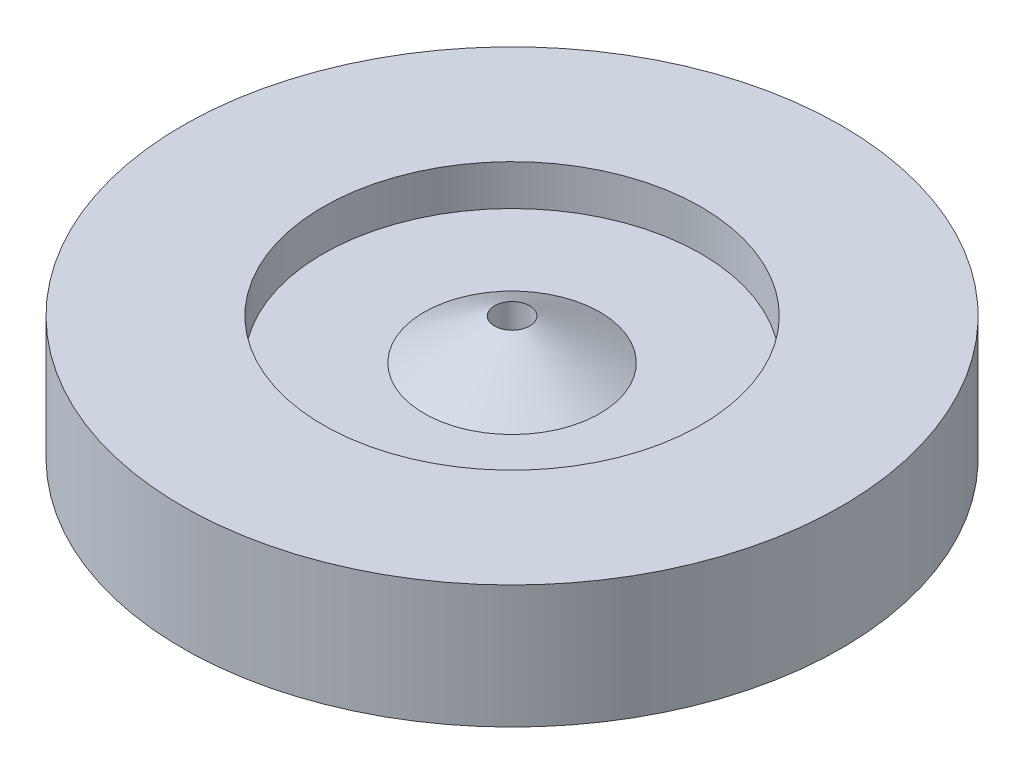
ISO-10303-21;
HEADER;
FILE_DESCRIPTION(('STEP AP214'),'2;1');
FILE_NAME('part.step','',(''),(''),'','','');
FILE_SCHEMA(('AUTOMOTIVE_DESIGN { 1 0 10303 214 1 1 1 1 }'));
ENDSEC;
DATA;
#1=APPLICATION_CONTEXT('core data for automotive mechanical design processes');
#2=APPLICATION_PROTOCOL_DEFINITION('international standard','automotive_design',2000,#1);
#3=PRODUCT_CONTEXT('',#1,'mechanical');
#4=PRODUCT('Part','Part','',(#3));
#5=PRODUCT_RELATED_PRODUCT_CATEGORY('part','',(#4));
#6=PRODUCT_DEFINITION_FORMATION('','',#4);
#7=PRODUCT_DEFINITION_CONTEXT('part definition',#1,'design');
#8=PRODUCT_DEFINITION('design','',#6,#7);
#9=PRODUCT_DEFINITION_SHAPE('','',#8);
#10=(LENGTH_UNIT() NAMED_UNIT(*) SI_UNIT(.MILLI.,.METRE.));
#11=(NAMED_UNIT(*) PLANE_ANGLE_UNIT() SI_UNIT($,.RADIAN.));
#12=(NAMED_UNIT(*) SI_UNIT($,.STERADIAN.) SOLID_ANGLE_UNIT());
#13=UNCERTAINTY_MEASURE_WITH_UNIT(LENGTH_MEASURE(1.E-05),#10,'distance_accuracy_value','');
#14=(GEOMETRIC_REPRESENTATION_CONTEXT(3) GLOBAL_UNCERTAINTY_ASSIGNED_CONTEXT((#13)) GLOBAL_UNIT_ASSIGNED_CONTEXT((#10,
#11,#12)) REPRESENTATION_CONTEXT('',''));
#15=CARTESIAN_POINT('',(0.,0.,0.));
#16=DIRECTION('',(0.,0.,1.));
#17=DIRECTION('',(1.,0.,0.));
#18=AXIS2_PLACEMENT_3D('',#15,#16,#17);
#19=CARTESIAN_POINT('',(0.,11.9059892324149,0.));
#20=DIRECTION('',(0.,-1.,0.));
#21=DIRECTION('',(0.,0.,-1.));
#22=AXIS2_PLACEMENT_3D('',#19,#20,#21);
#23=CONICAL_SURFACE('',#22,50.,1.0471975511966);
#24=CARTESIAN_POINT('',(0.,35.,0.));
#25=DIRECTION('',(0.,-1.,0.));
#26=DIRECTION('',(0.,0.,-1.));
#27=AXIS2_PLACEMENT_3D('',#24,#25,#26);
#28=CIRCLE('',#27,10.);
#29=CARTESIAN_POINT('',(0.,35.,-10.));
#30=VERTEX_POINT('',#29);
#31=EDGE_CURVE('E10',#30,#30,#28,.T.);
#32=CARTESIAN_POINT('',(0.,11.9059892324149,0.));
#33=DIRECTION('',(0.,-1.,0.));
#34=DIRECTION('',(0.,0.,-1.));
#35=AXIS2_PLACEMENT_3D('',#32,#33,#34);
#36=CIRCLE('',#35,50.);
#37=CARTESIAN_POINT('',(0.,11.9059892324149,-50.));
#38=VERTEX_POINT('',#37);
#39=EDGE_CURVE('E65',#38,#38,#36,.T.);
#40=CARTESIAN_POINT('',(0.,35.,-10.));
#41=CARTESIAN_POINT('',(0.,34.7594373878377,-10.4166666666667));
#42=CARTESIAN_POINT('',(0.,34.5188747756753,-10.8333333333333));
#43=CARTESIAN_POINT('',(0.,34.0377495513506,-11.6666666666667));
#44=CARTESIAN_POINT('',(0.,33.7971869391883,-12.0833333333333));
#45=CARTESIAN_POINT('',(0.,33.3160617148636,-12.9166666666667));
#46=CARTESIAN_POINT('',(0.,33.0754991027012,-13.3333333333333));
#47=CARTESIAN_POINT('',(0.,32.5943738783766,-14.1666666666667));
#48=CARTESIAN_POINT('',(0.,32.3538112662142,-14.5833333333333));
#49=CARTESIAN_POINT('',(0.,31.8726860418895,-15.4166666666667));
#50=CARTESIAN_POINT('',(0.,31.6321234297272,-15.8333333333333));
#51=CARTESIAN_POINT('',(0.,31.1509982054025,-16.6666666666667));
#52=CARTESIAN_POINT('',(0.,30.9104355932401,-17.0833333333333));
#53=CARTESIAN_POINT('',(0.,30.4293103689154,-17.9166666666667));
#54=CARTESIAN_POINT('',(0.,30.1887477567531,-18.3333333333333));
#55=CARTESIAN_POINT('',(0.,29.7076225324284,-19.1666666666667));
#56=CARTESIAN_POINT('',(0.,29.4670599202661,-19.5833333333333));
#57=CARTESIAN_POINT('',(0.,28.9859346959414,-20.4166666666667));
#58=CARTESIAN_POINT('',(0.,28.745372083779,-20.8333333333333));
#59=CARTESIAN_POINT('',(0.,28.2642468594543,-21.6666666666667));
#60=CARTESIAN_POINT('',(0.,28.023684247292,-22.0833333333333));
#61=CARTESIAN_POINT('',(0.,27.5425590229673,-22.9166666666667));
#62=CARTESIAN_POINT('',(0.,27.301996410805,-23.3333333333333));
#63=CARTESIAN_POINT('',(0.,26.8208711864803,-24.1666666666667));
#64=CARTESIAN_POINT('',(0.,26.5803085743179,-24.5833333333333));
#65=CARTESIAN_POINT('',(0.,26.0991833499932,-25.4166666666667));
#66=CARTESIAN_POINT('',(0.,25.8586207378309,-25.8333333333333));
#67=CARTESIAN_POINT('',(0.,25.3774955135062,-26.6666666666667));
#68=CARTESIAN_POINT('',(0.,25.1369329013439,-27.0833333333333));
#69=CARTESIAN_POINT('',(0.,24.6558076770192,-27.9166666666667));
#70=CARTESIAN_POINT('',(0.,24.4152450648568,-28.3333333333333));
#71=CARTESIAN_POINT('',(0.,23.9341198405321,-29.1666666666667));
#72=CARTESIAN_POINT('',(0.,23.6935572283698,-29.5833333333333));
#73=CARTESIAN_POINT('',(0.,23.2124320040451,-30.4166666666667));
#74=CARTESIAN_POINT('',(0.,22.9718693918828,-30.8333333333333));
#75=CARTESIAN_POINT('',(0.,22.4907441675581,-31.6666666666667));
#76=CARTESIAN_POINT('',(0.,22.2501815553957,-32.0833333333333));
#77=CARTESIAN_POINT('',(0.,21.769056331071,-32.9166666666667));
#78=CARTESIAN_POINT('',(0.,21.5284937189087,-33.3333333333333));
#79=CARTESIAN_POINT('',(0.,21.047368494584,-34.1666666666667));
#80=CARTESIAN_POINT('',(0.,20.8068058824217,-34.5833333333333));
#81=CARTESIAN_POINT('',(0.,20.325680658097,-35.4166666666667));
#82=CARTESIAN_POINT('',(0.,20.0851180459346,-35.8333333333333));
#83=CARTESIAN_POINT('',(0.,19.6039928216099,-36.6666666666667));
#84=CARTESIAN_POINT('',(0.,19.3634302094476,-37.0833333333333));
#85=CARTESIAN_POINT('',(0.,18.8823049851229,-37.9166666666667));
#86=CARTESIAN_POINT('',(0.,18.6417423729606,-38.3333333333333));
#87=CARTESIAN_POINT('',(0.,18.1606171486359,-39.1666666666667));
#88=CARTESIAN_POINT('',(0.,17.9200545364735,-39.5833333333333));
#89=CARTESIAN_POINT('',(0.,17.4389293121488,-40.4166666666667));
#90=CARTESIAN_POINT('',(0.,17.1983666999865,-40.8333333333333));
#91=CARTESIAN_POINT('',(0.,16.7172414756618,-41.6666666666667));
#92=CARTESIAN_POINT('',(0.,16.4766788634995,-42.0833333333333));
#93=CARTESIAN_POINT('',(0.,15.9955536391748,-42.9166666666667));
#94=CARTESIAN_POINT('',(0.,15.7549910270124,-43.3333333333333));
#95=CARTESIAN_POINT('',(0.,15.2738658026877,-44.1666666666667));
#96=CARTESIAN_POINT('',(0.,15.0333031905254,-44.5833333333333));
#97=CARTESIAN_POINT('',(0.,14.5521779662007,-45.4166666666667));
#98=CARTESIAN_POINT('',(0.,14.3116153540384,-45.8333333333333));
#99=CARTESIAN_POINT('',(0.,13.8304901297137,-46.6666666666667));
#100=CARTESIAN_POINT('',(0.,13.5899275175513,-47.0833333333333));
#101=CARTESIAN_POINT('',(0.,13.1088022932266,-47.9166666666667));
#102=CARTESIAN_POINT('',(0.,12.8682396810643,-48.3333333333333));
#103=CARTESIAN_POINT('',(0.,12.3871144567396,-49.1666666666667));
#104=CARTESIAN_POINT('',(0.,12.1465518445773,-49.5833333333333));
#105=CARTESIAN_POINT('',(0.,11.9059892324149,-50.));
#106=B_SPLINE_CURVE_WITH_KNOTS('',3,(#40,#41,#42,#43,#44,#45,#46,#47,#48,#49,#50,#51,#52,#53,
#54,#55,#56,#57,#58,#59,#60,#61,#62,#63,#64,#65,#66,#67,#68,#69,#70,#71,#72,#73,#74,#75,#76,#77,
#78,#79,#80,#81,#82,#83,#84,#85,#86,#87,#88,#89,#90,#91,#92,#93,#94,#95,#96,#97,#98,#99,#100,
#101,#102,#103,#104,#105),.UNSPECIFIED.,.F.,.F.,(4,2,2,2,2,2,2,2,2,2,2,2,2,2,2,2,2,2,2,2,2,2,2,
2,2,2,2,2,2,2,2,2,4),(0.,1.44337567297407,2.88675134594813,4.3301270189222,5.77350269189626,
7.21687836487033,8.6602540378444,10.1036297108185,11.5470053837925,12.9903810567666,
14.4337567297407,15.8771324027147,17.3205080756888,18.7638837486628,20.2072594216369,
21.650635094611,23.094010767585,24.5373864405591,25.9807621135332,27.4241377865072,
28.8675134594813,30.3108891324554,31.7542648054294,33.1976404784035,34.6410161513776,
36.0843918243516,37.5277674973257,38.9711431702998,40.4145188432738,41.8578945162479,
43.301270189222,44.744645862196,46.1880215351701),.UNSPECIFIED.);
#107=EDGE_CURVE('BSEAM31',#30,#38,#106,.T.);
#108=ORIENTED_EDGE('',*,*,#31,.T.);
#109=ORIENTED_EDGE('',*,*,#39,.F.);
#110=ORIENTED_EDGE('',*,*,#107,.T.);
#111=ORIENTED_EDGE('',*,*,#107,.F.);
#112=EDGE_LOOP('',(#108,#110,#109,#111));
#113=FACE_BOUND('',#112,.T.);
#114=ADVANCED_FACE('F31',(#113),#23,.T.);
#115=CARTESIAN_POINT('',(0.,0.,0.));
#116=DIRECTION('',(0.,-1.,0.));
#117=DIRECTION('',(0.,0.,-1.));
#118=AXIS2_PLACEMENT_3D('',#115,#116,#117);
#119=CYLINDRICAL_SURFACE('',#118,10.);
#120=CARTESIAN_POINT('',(0.,-35.,0.));
#121=DIRECTION('',(0.,-1.,0.));
#122=DIRECTION('',(0.,0.,-1.));
#123=AXIS2_PLACEMENT_3D('',#120,#121,#122);
#124=CIRCLE('',#123,10.);
#125=CARTESIAN_POINT('',(0.,-35.,10.));
#126=VERTEX_POINT('',#125);
#127=EDGE_CURVE('E37',#126,#126,#124,.T.);
#128=ORIENTED_EDGE('',*,*,#127,.T.);
#129=EDGE_LOOP('',(#128));
#130=FACE_BOUND('',#129,.T.);
#131=ORIENTED_EDGE('',*,*,#31,.F.);
#132=EDGE_LOOP('',(#131));
#133=FACE_BOUND('',#132,.T.);
#134=ADVANCED_FACE('F73',(#130,#133),#119,.F.);
#135=CARTESIAN_POINT('',(0.,-35.,0.));
#136=DIRECTION('',(0.,1.,0.));
#137=DIRECTION('',(0.,0.,1.));
#138=AXIS2_PLACEMENT_3D('',#135,#136,#137);
#139=CONICAL_SURFACE('',#138,10.,1.0471975511966);
#140=CARTESIAN_POINT('',(0.,-11.9059892324149,0.));
#141=DIRECTION('',(0.,-1.,0.));
#142=DIRECTION('',(0.,0.,-1.));
#143=AXIS2_PLACEMENT_3D('',#140,#141,#142);
#144=CIRCLE('',#143,50.);
#145=CARTESIAN_POINT('',(0.,-11.9059892324149,50.));
#146=VERTEX_POINT('',#145);
#147=EDGE_CURVE('E41',#146,#146,#144,.T.);
#148=CARTESIAN_POINT('',(0.,-11.9059892324149,50.));
#149=CARTESIAN_POINT('',(0.,-12.1465518445773,49.5833333333333));
#150=CARTESIAN_POINT('',(0.,-12.3871144567396,49.1666666666667));
#151=CARTESIAN_POINT('',(0.,-12.8682396810643,48.3333333333333));
#152=CARTESIAN_POINT('',(0.,-13.1088022932266,47.9166666666667));
#153=CARTESIAN_POINT('',(0.,-13.5899275175513,47.0833333333333));
#154=CARTESIAN_POINT('',(0.,-13.8304901297137,46.6666666666667));
#155=CARTESIAN_POINT('',(0.,-14.3116153540384,45.8333333333333));
#156=CARTESIAN_POINT('',(0.,-14.5521779662007,45.4166666666667));
#157=CARTESIAN_POINT('',(0.,-15.0333031905254,44.5833333333333));
#158=CARTESIAN_POINT('',(0.,-15.2738658026877,44.1666666666667));
#159=CARTESIAN_POINT('',(0.,-15.7549910270124,43.3333333333333));
#160=CARTESIAN_POINT('',(0.,-15.9955536391748,42.9166666666667));
#161=CARTESIAN_POINT('',(0.,-16.4766788634995,42.0833333333333));
#162=CARTESIAN_POINT('',(0.,-16.7172414756618,41.6666666666667));
#163=CARTESIAN_POINT('',(0.,-17.1983666999865,40.8333333333333));
#164=CARTESIAN_POINT('',(0.,-17.4389293121488,40.4166666666667));
#165=CARTESIAN_POINT('',(0.,-17.9200545364735,39.5833333333333));
#166=CARTESIAN_POINT('',(0.,-18.1606171486359,39.1666666666667));
#167=CARTESIAN_POINT('',(0.,-18.6417423729606,38.3333333333333));
#168=CARTESIAN_POINT('',(0.,-18.8823049851229,37.9166666666667));
#169=CARTESIAN_POINT('',(0.,-19.3634302094476,37.0833333333333));
#170=CARTESIAN_POINT('',(0.,-19.6039928216099,36.6666666666667));
#171=CARTESIAN_POINT('',(0.,-20.0851180459346,35.8333333333333));
#172=CARTESIAN_POINT('',(0.,-20.325680658097,35.4166666666667));
#173=CARTESIAN_POINT('',(0.,-20.8068058824217,34.5833333333333));
#174=CARTESIAN_POINT('',(0.,-21.047368494584,34.1666666666667));
#175=CARTESIAN_POINT('',(0.,-21.5284937189087,33.3333333333333));
#176=CARTESIAN_POINT('',(0.,-21.769056331071,32.9166666666667));
#177=CARTESIAN_POINT('',(0.,-22.2501815553957,32.0833333333333));
#178=CARTESIAN_POINT('',(0.,-22.4907441675581,31.6666666666667));
#179=CARTESIAN_POINT('',(0.,-22.9718693918828,30.8333333333333));
#180=CARTESIAN_POINT('',(0.,-23.2124320040451,30.4166666666667));
#181=CARTESIAN_POINT('',(0.,-23.6935572283698,29.5833333333333));
#182=CARTESIAN_POINT('',(0.,-23.9341198405321,29.1666666666667));
#183=CARTESIAN_POINT('',(0.,-24.4152450648568,28.3333333333333));
#184=CARTESIAN_POINT('',(0.,-24.6558076770192,27.9166666666667));
#185=CARTESIAN_POINT('',(0.,-25.1369329013439,27.0833333333333));
#186=CARTESIAN_POINT('',(0.,-25.3774955135062,26.6666666666667));
#187=CARTESIAN_POINT('',(0.,-25.8586207378309,25.8333333333333));
#188=CARTESIAN_POINT('',(0.,-26.0991833499932,25.4166666666667));
#189=CARTESIAN_POINT('',(0.,-26.5803085743179,24.5833333333333));
#190=CARTESIAN_POINT('',(0.,-26.8208711864803,24.1666666666667));
#191=CARTESIAN_POINT('',(0.,-27.301996410805,23.3333333333333));
#192=CARTESIAN_POINT('',(0.,-27.5425590229673,22.9166666666667));
#193=CARTESIAN_POINT('',(0.,-28.023684247292,22.0833333333333));
#194=CARTESIAN_POINT('',(0.,-28.2642468594543,21.6666666666667));
#195=CARTESIAN_POINT('',(0.,-28.745372083779,20.8333333333333));
#196=CARTESIAN_POINT('',(0.,-28.9859346959414,20.4166666666667));
#197=CARTESIAN_POINT('',(0.,-29.4670599202661,19.5833333333333));
#198=CARTESIAN_POINT('',(0.,-29.7076225324284,19.1666666666667));
#199=CARTESIAN_POINT('',(0.,-30.1887477567531,18.3333333333333));
#200=CARTESIAN_POINT('',(0.,-30.4293103689154,17.9166666666667));
#201=CARTESIAN_POINT('',(0.,-30.9104355932401,17.0833333333333));
#202=CARTESIAN_POINT('',(0.,-31.1509982054025,16.6666666666667));
#203=CARTESIAN_POINT('',(0.,-31.6321234297272,15.8333333333333));
#204=CARTESIAN_POINT('',(0.,-31.8726860418895,15.4166666666667));
#205=CARTESIAN_POINT('',(0.,-32.3538112662142,14.5833333333333));
#206=CARTESIAN_POINT('',(0.,-32.5943738783766,14.1666666666667));
#207=CARTESIAN_POINT('',(0.,-33.0754991027012,13.3333333333333));
#208=CARTESIAN_POINT('',(0.,-33.3160617148636,12.9166666666667));
#209=CARTESIAN_POINT('',(0.,-33.7971869391883,12.0833333333333));
#210=CARTESIAN_POINT('',(0.,-34.0377495513506,11.6666666666667));
#211=CARTESIAN_POINT('',(0.,-34.5188747756753,10.8333333333333));
#212=CARTESIAN_POINT('',(0.,-34.7594373878377,10.4166666666667));
#213=CARTESIAN_POINT('',(0.,-35.,10.));
#214=B_SPLINE_CURVE_WITH_KNOTS('',3,(#148,#149,#150,#151,#152,#153,#154,#155,#156,#157,#158,
#159,#160,#161,#162,#163,#164,#165,#166,#167,#168,#169,#170,#171,#172,#173,#174,#175,#176,#177,
#178,#179,#180,#181,#182,#183,#184,#185,#186,#187,#188,#189,#190,#191,#192,#193,#194,#195,#196,
#197,#198,#199,#200,#201,#202,#203,#204,#205,#206,#207,#208,#209,#210,#211,#212,#213),
.UNSPECIFIED.,.F.,.F.,(4,2,2,2,2,2,2,2,2,2,2,2,2,2,2,2,2,2,2,2,2,2,2,2,2,2,2,2,2,2,2,2,4),(0.,
1.44337567297407,2.88675134594813,4.3301270189222,5.77350269189626,7.21687836487033,
8.6602540378444,10.1036297108185,11.5470053837925,12.9903810567666,14.4337567297406,
15.8771324027147,17.3205080756888,18.7638837486628,20.2072594216369,21.650635094611,
23.094010767585,24.5373864405591,25.9807621135332,27.4241377865072,28.8675134594813,
30.3108891324554,31.7542648054294,33.1976404784035,34.6410161513776,36.0843918243516,
37.5277674973257,38.9711431702998,40.4145188432738,41.8578945162479,43.301270189222,
44.744645862196,46.1880215351701),.UNSPECIFIED.);
#215=EDGE_CURVE('BSEAM77',#146,#126,#214,.T.);
#216=ORIENTED_EDGE('',*,*,#147,.T.);
#217=ORIENTED_EDGE('',*,*,#127,.F.);
#218=ORIENTED_EDGE('',*,*,#215,.T.);
#219=ORIENTED_EDGE('',*,*,#215,.F.);
#220=EDGE_LOOP('',(#216,#218,#217,#219));
#221=FACE_BOUND('',#220,.T.);
#222=ADVANCED_FACE('F77',(#221),#139,.T.);
#223=CARTESIAN_POINT('',(0.,-11.9059892324149,-50.));
#224=DIRECTION('',(0.,-1.,0.));
#225=DIRECTION('',(0.,0.,-1.));
#226=AXIS2_PLACEMENT_3D('',#223,#224,#225);
#227=PLANE('',#226);
#228=CARTESIAN_POINT('',(0.,-11.9059892324149,0.));
#229=DIRECTION('',(0.,-1.,0.));
#230=DIRECTION('',(0.,0.,-1.));
#231=AXIS2_PLACEMENT_3D('',#228,#229,#230);
#232=CIRCLE('',#231,107.5);
#233=CARTESIAN_POINT('',(0.,-11.9059892324149,-107.5));
#234=VERTEX_POINT('',#233);
#235=EDGE_CURVE('E45',#234,#234,#232,.T.);
#236=ORIENTED_EDGE('',*,*,#235,.T.);
#237=EDGE_LOOP('',(#236));
#238=FACE_BOUND('',#237,.T.);
#239=ORIENTED_EDGE('',*,*,#147,.F.);
#240=EDGE_LOOP('',(#239));
#241=FACE_BOUND('',#240,.T.);
#242=ADVANCED_FACE('F81',(#238,#241),#227,.T.);
#243=CARTESIAN_POINT('',(0.,0.,0.));
#244=DIRECTION('',(0.,-1.,0.));
#245=DIRECTION('',(0.,0.,-1.));
#246=AXIS2_PLACEMENT_3D('',#243,#244,#245);
#247=CYLINDRICAL_SURFACE('',#246,107.5);
#248=CARTESIAN_POINT('',(0.,-35.,0.));
#249=DIRECTION('',(0.,-1.,0.));
#250=DIRECTION('',(0.,0.,-1.));
#251=AXIS2_PLACEMENT_3D('',#248,#249,#250);
#252=CIRCLE('',#251,107.5);
#253=CARTESIAN_POINT('',(0.,-35.,-107.5));
#254=VERTEX_POINT('',#253);
#255=EDGE_CURVE('E50',#254,#254,#252,.T.);
#256=ORIENTED_EDGE('',*,*,#255,.T.);
#257=EDGE_LOOP('',(#256));
#258=FACE_BOUND('',#257,.T.);
#259=ORIENTED_EDGE('',*,*,#235,.F.);
#260=EDGE_LOOP('',(#259));
#261=FACE_BOUND('',#260,.T.);
#262=ADVANCED_FACE('F88',(#258,#261),#247,.F.);
#263=CARTESIAN_POINT('',(0.,-35.,-107.5));
#264=DIRECTION('',(0.,-1.,0.));
#265=DIRECTION('',(0.,0.,-1.));
#266=AXIS2_PLACEMENT_3D('',#263,#264,#265);
#267=PLANE('',#266);
#268=CARTESIAN_POINT('',(0.,-35.,0.));
#269=DIRECTION('',(0.,-1.,0.));
#270=DIRECTION('',(0.,0.,-1.));
#271=AXIS2_PLACEMENT_3D('',#268,#269,#270);
#272=CIRCLE('',#271,187.5);
#273=CARTESIAN_POINT('',(0.,-35.,-187.5));
#274=VERTEX_POINT('',#273);
#275=EDGE_CURVE('E53',#274,#274,#272,.T.);
#276=ORIENTED_EDGE('',*,*,#275,.T.);
#277=EDGE_LOOP('',(#276));
#278=FACE_BOUND('',#277,.T.);
#279=ORIENTED_EDGE('',*,*,#255,.F.);
#280=EDGE_LOOP('',(#279));
#281=FACE_BOUND('',#280,.T.);
#282=ADVANCED_FACE('F92',(#278,#281),#267,.T.);
#283=CARTESIAN_POINT('',(0.,0.,0.));
#284=DIRECTION('',(0.,-1.,0.));
#285=DIRECTION('',(0.,0.,-1.));
#286=AXIS2_PLACEMENT_3D('',#283,#284,#285);
#287=CYLINDRICAL_SURFACE('',#286,187.5);
#288=CARTESIAN_POINT('',(0.,35.,0.));
#289=DIRECTION('',(0.,-1.,0.));
#290=DIRECTION('',(0.,0.,-1.));
#291=AXIS2_PLACEMENT_3D('',#288,#289,#290);
#292=CIRCLE('',#291,187.5);
#293=CARTESIAN_POINT('',(0.,35.,-187.5));
#294=VERTEX_POINT('',#293);
#295=EDGE_CURVE('E56',#294,#294,#292,.T.);
#296=ORIENTED_EDGE('',*,*,#295,.T.);
#297=EDGE_LOOP('',(#296));
#298=FACE_BOUND('',#297,.T.);
#299=ORIENTED_EDGE('',*,*,#275,.F.);
#300=EDGE_LOOP('',(#299));
#301=FACE_BOUND('',#300,.T.);
#302=ADVANCED_FACE('F96',(#298,#301),#287,.T.);
#303=CARTESIAN_POINT('',(0.,35.,-107.5));
#304=DIRECTION('',(0.,1.,0.));
#305=DIRECTION('',(0.,0.,1.));
#306=AXIS2_PLACEMENT_3D('',#303,#304,#305);
#307=PLANE('',#306);
#308=CARTESIAN_POINT('',(0.,35.,0.));
#309=DIRECTION('',(0.,-1.,0.));
#310=DIRECTION('',(0.,0.,-1.));
#311=AXIS2_PLACEMENT_3D('',#308,#309,#310);
#312=CIRCLE('',#311,107.5);
#313=CARTESIAN_POINT('',(0.,35.,-107.5));
#314=VERTEX_POINT('',#313);
#315=EDGE_CURVE('E59',#314,#314,#312,.T.);
#316=ORIENTED_EDGE('',*,*,#315,.T.);
#317=EDGE_LOOP('',(#316));
#318=FACE_BOUND('',#317,.T.);
#319=ORIENTED_EDGE('',*,*,#295,.F.);
#320=EDGE_LOOP('',(#319));
#321=FACE_BOUND('',#320,.T.);
#322=ADVANCED_FACE('F100',(#318,#321),#307,.T.);
#323=CARTESIAN_POINT('',(0.,0.,0.));
#324=DIRECTION('',(0.,-1.,0.));
#325=DIRECTION('',(0.,0.,-1.));
#326=AXIS2_PLACEMENT_3D('',#323,#324,#325);
#327=CYLINDRICAL_SURFACE('',#326,107.5);
#328=CARTESIAN_POINT('',(0.,11.9059892324149,0.));
#329=DIRECTION('',(0.,-1.,0.));
#330=DIRECTION('',(0.,0.,-1.));
#331=AXIS2_PLACEMENT_3D('',#328,#329,#330);
#332=CIRCLE('',#331,107.5);
#333=CARTESIAN_POINT('',(0.,11.9059892324149,-107.5));
#334=VERTEX_POINT('',#333);
#335=EDGE_CURVE('E62',#334,#334,#332,.T.);
#336=ORIENTED_EDGE('',*,*,#335,.T.);
#337=EDGE_LOOP('',(#336));
#338=FACE_BOUND('',#337,.T.);
#339=ORIENTED_EDGE('',*,*,#315,.F.);
#340=EDGE_LOOP('',(#339));
#341=FACE_BOUND('',#340,.T.);
#342=ADVANCED_FACE('F104',(#338,#341),#327,.F.);
#343=CARTESIAN_POINT('',(0.,11.9059892324149,-50.));
#344=DIRECTION('',(0.,1.,0.));
#345=DIRECTION('',(0.,0.,1.));
#346=AXIS2_PLACEMENT_3D('',#343,#344,#345);
#347=PLANE('',#346);
#348=ORIENTED_EDGE('',*,*,#39,.T.);
#349=EDGE_LOOP('',(#348));
#350=FACE_BOUND('',#349,.T.);
#351=ORIENTED_EDGE('',*,*,#335,.F.);
#352=EDGE_LOOP('',(#351));
#353=FACE_BOUND('',#352,.T.);
#354=ADVANCED_FACE('F69',(#350,#353),#347,.T.);
#355=CLOSED_SHELL('',(#114,#134,#222,#242,#262,#282,#302,#322,#342,#354));
#356=MANIFOLD_SOLID_BREP('B2',#355);
#357=ADVANCED_BREP_SHAPE_REPRESENTATION('',(#18,#356),#14);
#358=SHAPE_DEFINITION_REPRESENTATION(#9,#357);
ENDSEC;
END-ISO-10303-21;
